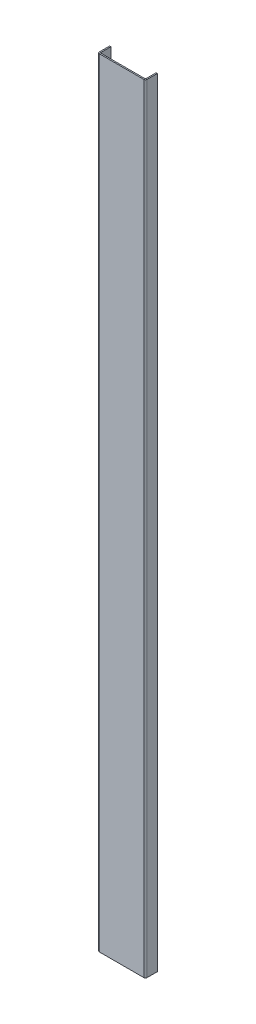
ISO-10303-21;
HEADER;
FILE_DESCRIPTION(('STEP AP214'),'2;1');
FILE_NAME('part.step','',(''),(''),'','','');
FILE_SCHEMA(('AUTOMOTIVE_DESIGN { 1 0 10303 214 1 1 1 1 }'));
ENDSEC;
DATA;
#1=APPLICATION_CONTEXT('core data for automotive mechanical design processes');
#2=APPLICATION_PROTOCOL_DEFINITION('international standard','automotive_design',2000,#1);
#3=PRODUCT_CONTEXT('',#1,'mechanical');
#4=PRODUCT('Part','Part','',(#3));
#5=PRODUCT_RELATED_PRODUCT_CATEGORY('part','',(#4));
#6=PRODUCT_DEFINITION_FORMATION('','',#4);
#7=PRODUCT_DEFINITION_CONTEXT('part definition',#1,'design');
#8=PRODUCT_DEFINITION('design','',#6,#7);
#9=PRODUCT_DEFINITION_SHAPE('','',#8);
#10=(LENGTH_UNIT() NAMED_UNIT(*) SI_UNIT(.MILLI.,.METRE.));
#11=(NAMED_UNIT(*) PLANE_ANGLE_UNIT() SI_UNIT($,.RADIAN.));
#12=(NAMED_UNIT(*) SI_UNIT($,.STERADIAN.) SOLID_ANGLE_UNIT());
#13=UNCERTAINTY_MEASURE_WITH_UNIT(LENGTH_MEASURE(1.E-05),#10,'distance_accuracy_value','');
#14=(GEOMETRIC_REPRESENTATION_CONTEXT(3) GLOBAL_UNCERTAINTY_ASSIGNED_CONTEXT((#13)) GLOBAL_UNIT_ASSIGNED_CONTEXT((#10,
#11,#12)) REPRESENTATION_CONTEXT('',''));
#15=CARTESIAN_POINT('',(0.,0.,0.));
#16=DIRECTION('',(0.,0.,1.));
#17=DIRECTION('',(1.,0.,0.));
#18=AXIS2_PLACEMENT_3D('',#15,#16,#17);
#19=CARTESIAN_POINT('',(-28.25,921.5,-1.99999999999999));
#20=DIRECTION('',(0.,1.,0.));
#21=DIRECTION('',(0.,0.,1.));
#22=AXIS2_PLACEMENT_3D('',#19,#20,#21);
#23=PLANE('',#22);
#24=DIRECTION('',(1.,0.,0.));
#25=VECTOR('',#24,1.);
#26=CARTESIAN_POINT('',(-28.25,921.5,-1.99999999999999));
#27=LINE('',#26,#25);
#28=CARTESIAN_POINT('',(-28.25,921.5,-1.99999999999999));
#29=VERTEX_POINT('',#28);
#30=CARTESIAN_POINT('',(-26.75,921.5,-1.99999999999999));
#31=VERTEX_POINT('',#30);
#32=EDGE_CURVE('E11',#29,#31,#27,.T.);
#33=ORIENTED_EDGE('',*,*,#32,.F.);
#34=CARTESIAN_POINT('',(-26.25,921.5,-1.99999999999999));
#35=DIRECTION('',(0.,-1.,0.));
#36=DIRECTION('',(0.,0.,-1.));
#37=AXIS2_PLACEMENT_3D('',#34,#35,#36);
#38=CIRCLE('',#37,2.);
#39=CARTESIAN_POINT('',(-26.25,921.5,0.));
#40=VERTEX_POINT('',#39);
#41=EDGE_CURVE('E148',#29,#40,#38,.F.);
#42=ORIENTED_EDGE('',*,*,#41,.T.);
#43=DIRECTION('',(0.,0.,1.));
#44=VECTOR('',#43,1.);
#45=CARTESIAN_POINT('',(-26.25,921.5,-1.49999999999999));
#46=LINE('',#45,#44);
#47=CARTESIAN_POINT('',(-26.25,921.5,-1.49999999999999));
#48=VERTEX_POINT('',#47);
#49=EDGE_CURVE('E46',#48,#40,#46,.T.);
#50=ORIENTED_EDGE('',*,*,#49,.F.);
#51=CARTESIAN_POINT('',(-26.25,921.5,-1.99999999999999));
#52=DIRECTION('',(0.,1.,0.));
#53=DIRECTION('',(1.,0.,0.));
#54=AXIS2_PLACEMENT_3D('',#51,#52,#53);
#55=CIRCLE('',#54,0.5);
#56=EDGE_CURVE('E242',#31,#48,#55,.T.);
#57=ORIENTED_EDGE('',*,*,#56,.F.);
#58=EDGE_LOOP('',(#33,#42,#50,#57));
#59=FACE_BOUND('',#58,.T.);
#60=ADVANCED_FACE('F38',(#59),#23,.T.);
#61=CARTESIAN_POINT('',(-26.25,921.5,-1.49999999999999));
#62=DIRECTION('',(0.,1.,0.));
#63=DIRECTION('',(0.,0.,1.));
#64=AXIS2_PLACEMENT_3D('',#61,#62,#63);
#65=PLANE('',#64);
#66=DIRECTION('',(0.,0.,1.));
#67=VECTOR('',#66,1.);
#68=CARTESIAN_POINT('',(-28.25,921.5,0.));
#69=LINE('',#68,#67);
#70=CARTESIAN_POINT('',(-28.25,921.5,-14.));
#71=VERTEX_POINT('',#70);
#72=EDGE_CURVE('E153',#71,#29,#69,.T.);
#73=ORIENTED_EDGE('',*,*,#72,.T.);
#74=ORIENTED_EDGE('',*,*,#32,.T.);
#75=DIRECTION('',(0.,0.,1.));
#76=VECTOR('',#75,1.);
#77=CARTESIAN_POINT('',(-26.75,921.5,0.));
#78=LINE('',#77,#76);
#79=CARTESIAN_POINT('',(-26.75,921.5,-14.));
#80=VERTEX_POINT('',#79);
#81=EDGE_CURVE('E255',#80,#31,#78,.T.);
#82=ORIENTED_EDGE('',*,*,#81,.F.);
#83=DIRECTION('',(1.,0.,0.));
#84=VECTOR('',#83,1.);
#85=CARTESIAN_POINT('',(-28.25,921.5,-14.));
#86=LINE('',#85,#84);
#87=EDGE_CURVE('E257',#71,#80,#86,.T.);
#88=ORIENTED_EDGE('',*,*,#87,.F.);
#89=EDGE_LOOP('',(#73,#74,#82,#88));
#90=FACE_BOUND('',#89,.T.);
#91=ADVANCED_FACE('F268',(#90),#65,.T.);
#92=CARTESIAN_POINT('',(-26.25,0.,0.));
#93=DIRECTION('',(0.,-1.,0.));
#94=DIRECTION('',(0.,0.,-1.));
#95=AXIS2_PLACEMENT_3D('',#92,#93,#94);
#96=PLANE('',#95);
#97=DIRECTION('',(0.,0.,-1.));
#98=VECTOR('',#97,1.);
#99=CARTESIAN_POINT('',(-26.25,0.,0.));
#100=LINE('',#99,#98);
#101=CARTESIAN_POINT('',(-26.25,0.,0.));
#102=VERTEX_POINT('',#101);
#103=CARTESIAN_POINT('',(-26.25,0.,-1.49999999999999));
#104=VERTEX_POINT('',#103);
#105=EDGE_CURVE('E146',#102,#104,#100,.T.);
#106=ORIENTED_EDGE('',*,*,#105,.F.);
#107=CARTESIAN_POINT('',(-26.25,0.,-1.99999999999999));
#108=DIRECTION('',(0.,-1.,0.));
#109=DIRECTION('',(0.,0.,-1.));
#110=AXIS2_PLACEMENT_3D('',#107,#108,#109);
#111=CIRCLE('',#110,2.);
#112=CARTESIAN_POINT('',(-28.25,0.,-1.99999999999999));
#113=VERTEX_POINT('',#112);
#114=EDGE_CURVE('E160',#113,#102,#111,.F.);
#115=ORIENTED_EDGE('',*,*,#114,.F.);
#116=DIRECTION('',(-1.,0.,0.));
#117=VECTOR('',#116,1.);
#118=CARTESIAN_POINT('',(-26.75,0.,-1.99999999999999));
#119=LINE('',#118,#117);
#120=CARTESIAN_POINT('',(-26.75,0.,-1.99999999999999));
#121=VERTEX_POINT('',#120);
#122=EDGE_CURVE('E233',#121,#113,#119,.T.);
#123=ORIENTED_EDGE('',*,*,#122,.F.);
#124=CARTESIAN_POINT('',(-26.25,0.,-1.99999999999999));
#125=DIRECTION('',(0.,1.,0.));
#126=DIRECTION('',(1.,0.,0.));
#127=AXIS2_PLACEMENT_3D('',#124,#125,#126);
#128=CIRCLE('',#127,0.5);
#129=EDGE_CURVE('E187',#121,#104,#128,.T.);
#130=ORIENTED_EDGE('',*,*,#129,.T.);
#131=EDGE_LOOP('',(#106,#115,#123,#130));
#132=FACE_BOUND('',#131,.T.);
#133=ADVANCED_FACE('F247',(#132),#96,.T.);
#134=CARTESIAN_POINT('',(-26.75,0.,-1.99999999999999));
#135=DIRECTION('',(0.,-1.,0.));
#136=DIRECTION('',(0.,0.,-1.));
#137=AXIS2_PLACEMENT_3D('',#134,#135,#136);
#138=PLANE('',#137);
#139=DIRECTION('',(1.,0.,0.));
#140=VECTOR('',#139,1.);
#141=CARTESIAN_POINT('',(28.25,0.,0.));
#142=LINE('',#141,#140);
#143=CARTESIAN_POINT('',(26.25,0.,0.));
#144=VERTEX_POINT('',#143);
#145=EDGE_CURVE('E200',#102,#144,#142,.T.);
#146=ORIENTED_EDGE('',*,*,#145,.F.);
#147=ORIENTED_EDGE('',*,*,#105,.T.);
#148=DIRECTION('',(1.,0.,0.));
#149=VECTOR('',#148,1.);
#150=CARTESIAN_POINT('',(28.25,0.,-1.50000000000001));
#151=LINE('',#150,#149);
#152=CARTESIAN_POINT('',(26.25,0.,-1.50000000000001));
#153=VERTEX_POINT('',#152);
#154=EDGE_CURVE('E185',#104,#153,#151,.T.);
#155=ORIENTED_EDGE('',*,*,#154,.T.);
#156=DIRECTION('',(0.,0.,1.));
#157=VECTOR('',#156,1.);
#158=CARTESIAN_POINT('',(26.25,0.,-1.50000000000001));
#159=LINE('',#158,#157);
#160=EDGE_CURVE('E95',#153,#144,#159,.T.);
#161=ORIENTED_EDGE('',*,*,#160,.T.);
#162=EDGE_LOOP('',(#146,#147,#155,#161));
#163=FACE_BOUND('',#162,.T.);
#164=ADVANCED_FACE('F235',(#163),#138,.T.);
#165=CARTESIAN_POINT('',(26.25,921.5,0.));
#166=DIRECTION('',(0.,1.,0.));
#167=DIRECTION('',(0.,0.,1.));
#168=AXIS2_PLACEMENT_3D('',#165,#166,#167);
#169=PLANE('',#168);
#170=DIRECTION('',(0.,0.,-1.));
#171=VECTOR('',#170,1.);
#172=CARTESIAN_POINT('',(26.25,921.5,0.));
#173=LINE('',#172,#171);
#174=CARTESIAN_POINT('',(26.25,921.5,0.));
#175=VERTEX_POINT('',#174);
#176=CARTESIAN_POINT('',(26.25,921.5,-1.50000000000001));
#177=VERTEX_POINT('',#176);
#178=EDGE_CURVE('E231',#175,#177,#173,.T.);
#179=ORIENTED_EDGE('',*,*,#178,.F.);
#180=CARTESIAN_POINT('',(26.25,921.5,-2.00000000000001));
#181=DIRECTION('',(0.,-1.,0.));
#182=DIRECTION('',(0.,0.,-1.));
#183=AXIS2_PLACEMENT_3D('',#180,#181,#182);
#184=CIRCLE('',#183,2.);
#185=CARTESIAN_POINT('',(28.25,921.5,-2.00000000000001));
#186=VERTEX_POINT('',#185);
#187=EDGE_CURVE('E168',#175,#186,#184,.F.);
#188=ORIENTED_EDGE('',*,*,#187,.T.);
#189=DIRECTION('',(1.,0.,0.));
#190=VECTOR('',#189,1.);
#191=CARTESIAN_POINT('',(26.75,921.5,-2.00000000000001));
#192=LINE('',#191,#190);
#193=CARTESIAN_POINT('',(26.75,921.5,-2.00000000000001));
#194=VERTEX_POINT('',#193);
#195=EDGE_CURVE('E54',#194,#186,#192,.T.);
#196=ORIENTED_EDGE('',*,*,#195,.F.);
#197=CARTESIAN_POINT('',(26.25,921.5,-2.00000000000001));
#198=DIRECTION('',(0.,1.,0.));
#199=DIRECTION('',(1.,0.,0.));
#200=AXIS2_PLACEMENT_3D('',#197,#198,#199);
#201=CIRCLE('',#200,0.5);
#202=EDGE_CURVE('E259',#177,#194,#201,.T.);
#203=ORIENTED_EDGE('',*,*,#202,.F.);
#204=EDGE_LOOP('',(#179,#188,#196,#203));
#205=FACE_BOUND('',#204,.T.);
#206=ADVANCED_FACE('F294',(#205),#169,.T.);
#207=CARTESIAN_POINT('',(26.75,921.5,-2.00000000000001));
#208=DIRECTION('',(0.,1.,0.));
#209=DIRECTION('',(0.,0.,1.));
#210=AXIS2_PLACEMENT_3D('',#207,#208,#209);
#211=PLANE('',#210);
#212=DIRECTION('',(1.,0.,0.));
#213=VECTOR('',#212,1.);
#214=CARTESIAN_POINT('',(28.25,921.5,0.));
#215=LINE('',#214,#213);
#216=EDGE_CURVE('E138',#40,#175,#215,.T.);
#217=ORIENTED_EDGE('',*,*,#216,.T.);
#218=ORIENTED_EDGE('',*,*,#178,.T.);
#219=DIRECTION('',(1.,0.,0.));
#220=VECTOR('',#219,1.);
#221=CARTESIAN_POINT('',(28.25,921.5,-1.50000000000001));
#222=LINE('',#221,#220);
#223=EDGE_CURVE('E141',#48,#177,#222,.T.);
#224=ORIENTED_EDGE('',*,*,#223,.F.);
#225=ORIENTED_EDGE('',*,*,#49,.T.);
#226=EDGE_LOOP('',(#217,#218,#224,#225));
#227=FACE_BOUND('',#226,.T.);
#228=ADVANCED_FACE('F136',(#227),#211,.T.);
#229=CARTESIAN_POINT('',(28.25,0.,-2.00000000000001));
#230=DIRECTION('',(0.,-1.,0.));
#231=DIRECTION('',(0.,0.,-1.));
#232=AXIS2_PLACEMENT_3D('',#229,#230,#231);
#233=PLANE('',#232);
#234=DIRECTION('',(-1.,0.,0.));
#235=VECTOR('',#234,1.);
#236=CARTESIAN_POINT('',(28.25,0.,-2.00000000000001));
#237=LINE('',#236,#235);
#238=CARTESIAN_POINT('',(28.25,0.,-2.00000000000001));
#239=VERTEX_POINT('',#238);
#240=CARTESIAN_POINT('',(26.75,0.,-2.00000000000001));
#241=VERTEX_POINT('',#240);
#242=EDGE_CURVE('E102',#239,#241,#237,.T.);
#243=ORIENTED_EDGE('',*,*,#242,.F.);
#244=CARTESIAN_POINT('',(26.25,0.,-2.00000000000001));
#245=DIRECTION('',(0.,-1.,0.));
#246=DIRECTION('',(0.,0.,-1.));
#247=AXIS2_PLACEMENT_3D('',#244,#245,#246);
#248=CIRCLE('',#247,2.);
#249=EDGE_CURVE('E202',#144,#239,#248,.F.);
#250=ORIENTED_EDGE('',*,*,#249,.F.);
#251=ORIENTED_EDGE('',*,*,#160,.F.);
#252=CARTESIAN_POINT('',(26.25,0.,-2.00000000000001));
#253=DIRECTION('',(0.,1.,0.));
#254=DIRECTION('',(1.,0.,0.));
#255=AXIS2_PLACEMENT_3D('',#252,#253,#254);
#256=CIRCLE('',#255,0.5);
#257=EDGE_CURVE('E183',#153,#241,#256,.T.);
#258=ORIENTED_EDGE('',*,*,#257,.T.);
#259=EDGE_LOOP('',(#243,#250,#251,#258));
#260=FACE_BOUND('',#259,.T.);
#261=ADVANCED_FACE('F300',(#260),#233,.T.);
#262=CARTESIAN_POINT('',(26.25,0.,-1.50000000000001));
#263=DIRECTION('',(0.,-1.,0.));
#264=DIRECTION('',(0.,0.,-1.));
#265=AXIS2_PLACEMENT_3D('',#262,#263,#264);
#266=PLANE('',#265);
#267=DIRECTION('',(0.,0.,-1.));
#268=VECTOR('',#267,1.);
#269=CARTESIAN_POINT('',(28.25,0.,0.));
#270=LINE('',#269,#268);
#271=CARTESIAN_POINT('',(28.25,0.,-14.));
#272=VERTEX_POINT('',#271);
#273=EDGE_CURVE('E174',#239,#272,#270,.T.);
#274=ORIENTED_EDGE('',*,*,#273,.F.);
#275=ORIENTED_EDGE('',*,*,#242,.T.);
#276=DIRECTION('',(0.,0.,-1.));
#277=VECTOR('',#276,1.);
#278=CARTESIAN_POINT('',(26.75,0.,0.));
#279=LINE('',#278,#277);
#280=CARTESIAN_POINT('',(26.75,0.,-14.));
#281=VERTEX_POINT('',#280);
#282=EDGE_CURVE('E180',#241,#281,#279,.T.);
#283=ORIENTED_EDGE('',*,*,#282,.T.);
#284=DIRECTION('',(1.,0.,0.));
#285=VECTOR('',#284,1.);
#286=CARTESIAN_POINT('',(26.75,0.,-14.));
#287=LINE('',#286,#285);
#288=EDGE_CURVE('E177',#281,#272,#287,.T.);
#289=ORIENTED_EDGE('',*,*,#288,.T.);
#290=EDGE_LOOP('',(#274,#275,#283,#289));
#291=FACE_BOUND('',#290,.T.);
#292=ADVANCED_FACE('F303',(#291),#266,.T.);
#293=CARTESIAN_POINT('',(28.25,921.5,0.));
#294=DIRECTION('',(-1.,0.,0.));
#295=DIRECTION('',(0.,0.,1.));
#296=AXIS2_PLACEMENT_3D('',#293,#294,#295);
#297=PLANE('',#296);
#298=ORIENTED_EDGE('',*,*,#273,.T.);
#299=DIRECTION('',(0.,-1.,0.));
#300=VECTOR('',#299,1.);
#301=CARTESIAN_POINT('',(28.25,921.5,-14.));
#302=LINE('',#301,#300);
#303=CARTESIAN_POINT('',(28.25,921.5,-14.));
#304=VERTEX_POINT('',#303);
#305=EDGE_CURVE('E226',#304,#272,#302,.T.);
#306=ORIENTED_EDGE('',*,*,#305,.F.);
#307=DIRECTION('',(0.,0.,-1.));
#308=VECTOR('',#307,1.);
#309=CARTESIAN_POINT('',(28.25,921.5,0.));
#310=LINE('',#309,#308);
#311=EDGE_CURVE('E108',#186,#304,#310,.T.);
#312=ORIENTED_EDGE('',*,*,#311,.F.);
#313=DIRECTION('',(0.,-1.,0.));
#314=VECTOR('',#313,1.);
#315=CARTESIAN_POINT('',(28.25,921.5,-2.00000000000001));
#316=LINE('',#315,#314);
#317=EDGE_CURVE('E170',#186,#239,#316,.T.);
#318=ORIENTED_EDGE('',*,*,#317,.T.);
#319=EDGE_LOOP('',(#298,#306,#312,#318));
#320=FACE_BOUND('',#319,.T.);
#321=ADVANCED_FACE('F306',(#320),#297,.F.);
#322=CARTESIAN_POINT('',(26.75,921.5,-14.));
#323=DIRECTION('',(0.,0.,-1.));
#324=DIRECTION('',(-1.,0.,0.));
#325=AXIS2_PLACEMENT_3D('',#322,#323,#324);
#326=PLANE('',#325);
#327=ORIENTED_EDGE('',*,*,#288,.F.);
#328=DIRECTION('',(0.,-1.,0.));
#329=VECTOR('',#328,1.);
#330=CARTESIAN_POINT('',(26.75,921.5,-14.));
#331=LINE('',#330,#329);
#332=CARTESIAN_POINT('',(26.75,921.5,-14.));
#333=VERTEX_POINT('',#332);
#334=EDGE_CURVE('E224',#333,#281,#331,.T.);
#335=ORIENTED_EDGE('',*,*,#334,.F.);
#336=DIRECTION('',(1.,0.,0.));
#337=VECTOR('',#336,1.);
#338=CARTESIAN_POINT('',(26.75,921.5,-14.));
#339=LINE('',#338,#337);
#340=EDGE_CURVE('E514',#333,#304,#339,.T.);
#341=ORIENTED_EDGE('',*,*,#340,.T.);
#342=ORIENTED_EDGE('',*,*,#305,.T.);
#343=EDGE_LOOP('',(#327,#335,#341,#342));
#344=FACE_BOUND('',#343,.T.);
#345=ADVANCED_FACE('F310',(#344),#326,.T.);
#346=CARTESIAN_POINT('',(26.75,921.5,0.));
#347=DIRECTION('',(-1.,0.,0.));
#348=DIRECTION('',(0.,0.,1.));
#349=AXIS2_PLACEMENT_3D('',#346,#347,#348);
#350=PLANE('',#349);
#351=ORIENTED_EDGE('',*,*,#282,.F.);
#352=DIRECTION('',(0.,-1.,0.));
#353=VECTOR('',#352,1.);
#354=CARTESIAN_POINT('',(26.75,921.5,-2.00000000000001));
#355=LINE('',#354,#353);
#356=EDGE_CURVE('E221',#194,#241,#355,.T.);
#357=ORIENTED_EDGE('',*,*,#356,.F.);
#358=DIRECTION('',(0.,0.,-1.));
#359=VECTOR('',#358,1.);
#360=CARTESIAN_POINT('',(26.75,921.5,0.));
#361=LINE('',#360,#359);
#362=EDGE_CURVE('E516',#194,#333,#361,.T.);
#363=ORIENTED_EDGE('',*,*,#362,.T.);
#364=ORIENTED_EDGE('',*,*,#334,.T.);
#365=EDGE_LOOP('',(#351,#357,#363,#364));
#366=FACE_BOUND('',#365,.T.);
#367=ADVANCED_FACE('F314',(#366),#350,.T.);
#368=CARTESIAN_POINT('',(26.25,921.5,-2.00000000000001));
#369=DIRECTION('',(0.,-1.,0.));
#370=DIRECTION('',(0.,0.,-1.));
#371=AXIS2_PLACEMENT_3D('',#368,#369,#370);
#372=CYLINDRICAL_SURFACE('',#371,0.5);
#373=ORIENTED_EDGE('',*,*,#257,.F.);
#374=DIRECTION('',(0.,-1.,0.));
#375=VECTOR('',#374,1.);
#376=CARTESIAN_POINT('',(26.25,921.5,-1.50000000000001));
#377=LINE('',#376,#375);
#378=EDGE_CURVE('E218',#177,#153,#377,.T.);
#379=ORIENTED_EDGE('',*,*,#378,.F.);
#380=ORIENTED_EDGE('',*,*,#202,.T.);
#381=ORIENTED_EDGE('',*,*,#356,.T.);
#382=EDGE_LOOP('',(#373,#379,#380,#381));
#383=FACE_BOUND('',#382,.T.);
#384=ADVANCED_FACE('F318',(#383),#372,.F.);
#385=CARTESIAN_POINT('',(28.25,921.5,-1.50000000000001));
#386=DIRECTION('',(0.,0.,-1.));
#387=DIRECTION('',(-1.,0.,0.));
#388=AXIS2_PLACEMENT_3D('',#385,#386,#387);
#389=PLANE('',#388);
#390=ORIENTED_EDGE('',*,*,#154,.F.);
#391=DIRECTION('',(0.,-1.,0.));
#392=VECTOR('',#391,1.);
#393=CARTESIAN_POINT('',(-26.25,921.5,-1.49999999999999));
#394=LINE('',#393,#392);
#395=EDGE_CURVE('E215',#48,#104,#394,.T.);
#396=ORIENTED_EDGE('',*,*,#395,.F.);
#397=ORIENTED_EDGE('',*,*,#223,.T.);
#398=ORIENTED_EDGE('',*,*,#378,.T.);
#399=EDGE_LOOP('',(#390,#396,#397,#398));
#400=FACE_BOUND('',#399,.T.);
#401=ADVANCED_FACE('F244',(#400),#389,.T.);
#402=CARTESIAN_POINT('',(-26.25,921.5,-1.99999999999999));
#403=DIRECTION('',(0.,-1.,0.));
#404=DIRECTION('',(0.,0.,-1.));
#405=AXIS2_PLACEMENT_3D('',#402,#403,#404);
#406=CYLINDRICAL_SURFACE('',#405,0.5);
#407=ORIENTED_EDGE('',*,*,#129,.F.);
#408=DIRECTION('',(0.,-1.,0.));
#409=VECTOR('',#408,1.);
#410=CARTESIAN_POINT('',(-26.75,921.5,-1.99999999999999));
#411=LINE('',#410,#409);
#412=EDGE_CURVE('E212',#31,#121,#411,.T.);
#413=ORIENTED_EDGE('',*,*,#412,.F.);
#414=ORIENTED_EDGE('',*,*,#56,.T.);
#415=ORIENTED_EDGE('',*,*,#395,.T.);
#416=EDGE_LOOP('',(#407,#413,#414,#415));
#417=FACE_BOUND('',#416,.T.);
#418=ADVANCED_FACE('F240',(#417),#406,.F.);
#419=CARTESIAN_POINT('',(-26.75,921.5,0.));
#420=DIRECTION('',(1.,0.,0.));
#421=DIRECTION('',(0.,0.,-1.));
#422=AXIS2_PLACEMENT_3D('',#419,#420,#421);
#423=PLANE('',#422);
#424=DIRECTION('',(0.,0.,1.));
#425=VECTOR('',#424,1.);
#426=CARTESIAN_POINT('',(-26.75,0.,0.));
#427=LINE('',#426,#425);
#428=CARTESIAN_POINT('',(-26.75,0.,-14.));
#429=VERTEX_POINT('',#428);
#430=EDGE_CURVE('E190',#429,#121,#427,.T.);
#431=ORIENTED_EDGE('',*,*,#430,.F.);
#432=DIRECTION('',(0.,-1.,0.));
#433=VECTOR('',#432,1.);
#434=CARTESIAN_POINT('',(-26.75,921.5,-14.));
#435=LINE('',#434,#433);
#436=EDGE_CURVE('E210',#80,#429,#435,.T.);
#437=ORIENTED_EDGE('',*,*,#436,.F.);
#438=ORIENTED_EDGE('',*,*,#81,.T.);
#439=ORIENTED_EDGE('',*,*,#412,.T.);
#440=EDGE_LOOP('',(#431,#437,#438,#439));
#441=FACE_BOUND('',#440,.T.);
#442=ADVANCED_FACE('F253',(#441),#423,.T.);
#443=CARTESIAN_POINT('',(-28.25,921.5,-14.));
#444=DIRECTION('',(0.,0.,-1.));
#445=DIRECTION('',(-1.,0.,0.));
#446=AXIS2_PLACEMENT_3D('',#443,#444,#445);
#447=PLANE('',#446);
#448=DIRECTION('',(1.,0.,0.));
#449=VECTOR('',#448,1.);
#450=CARTESIAN_POINT('',(-28.25,0.,-14.));
#451=LINE('',#450,#449);
#452=CARTESIAN_POINT('',(-28.25,0.,-14.));
#453=VERTEX_POINT('',#452);
#454=EDGE_CURVE('E193',#453,#429,#451,.T.);
#455=ORIENTED_EDGE('',*,*,#454,.F.);
#456=DIRECTION('',(0.,-1.,0.));
#457=VECTOR('',#456,1.);
#458=CARTESIAN_POINT('',(-28.25,921.5,-14.));
#459=LINE('',#458,#457);
#460=EDGE_CURVE('E208',#71,#453,#459,.T.);
#461=ORIENTED_EDGE('',*,*,#460,.F.);
#462=ORIENTED_EDGE('',*,*,#87,.T.);
#463=ORIENTED_EDGE('',*,*,#436,.T.);
#464=EDGE_LOOP('',(#455,#461,#462,#463));
#465=FACE_BOUND('',#464,.T.);
#466=ADVANCED_FACE('F274',(#465),#447,.T.);
#467=CARTESIAN_POINT('',(-28.25,921.5,0.));
#468=DIRECTION('',(1.,0.,0.));
#469=DIRECTION('',(0.,0.,-1.));
#470=AXIS2_PLACEMENT_3D('',#467,#468,#469);
#471=PLANE('',#470);
#472=DIRECTION('',(0.,0.,1.));
#473=VECTOR('',#472,1.);
#474=CARTESIAN_POINT('',(-28.25,0.,0.));
#475=LINE('',#474,#473);
#476=EDGE_CURVE('E196',#453,#113,#475,.T.);
#477=ORIENTED_EDGE('',*,*,#476,.T.);
#478=DIRECTION('',(0.,-1.,0.));
#479=VECTOR('',#478,1.);
#480=CARTESIAN_POINT('',(-28.25,921.5,-1.99999999999999));
#481=LINE('',#480,#479);
#482=EDGE_CURVE('E162',#29,#113,#481,.T.);
#483=ORIENTED_EDGE('',*,*,#482,.F.);
#484=ORIENTED_EDGE('',*,*,#72,.F.);
#485=ORIENTED_EDGE('',*,*,#460,.T.);
#486=EDGE_LOOP('',(#477,#483,#484,#485));
#487=FACE_BOUND('',#486,.T.);
#488=ADVANCED_FACE('F270',(#487),#471,.F.);
#489=CARTESIAN_POINT('',(-26.25,921.5,-1.99999999999999));
#490=DIRECTION('',(0.,-1.,0.));
#491=DIRECTION('',(0.,0.,-1.));
#492=AXIS2_PLACEMENT_3D('',#489,#490,#491);
#493=CYLINDRICAL_SURFACE('',#492,2.);
#494=ORIENTED_EDGE('',*,*,#114,.T.);
#495=DIRECTION('',(0.,-1.,0.));
#496=VECTOR('',#495,1.);
#497=CARTESIAN_POINT('',(-26.25,921.5,0.));
#498=LINE('',#497,#496);
#499=EDGE_CURVE('E157',#40,#102,#498,.T.);
#500=ORIENTED_EDGE('',*,*,#499,.F.);
#501=ORIENTED_EDGE('',*,*,#41,.F.);
#502=ORIENTED_EDGE('',*,*,#482,.T.);
#503=EDGE_LOOP('',(#494,#500,#501,#502));
#504=FACE_BOUND('',#503,.T.);
#505=ADVANCED_FACE('F158',(#504),#493,.T.);
#506=CARTESIAN_POINT('',(28.25,921.5,0.));
#507=DIRECTION('',(0.,0.,-1.));
#508=DIRECTION('',(-1.,0.,0.));
#509=AXIS2_PLACEMENT_3D('',#506,#507,#508);
#510=PLANE('',#509);
#511=ORIENTED_EDGE('',*,*,#145,.T.);
#512=DIRECTION('',(0.,-1.,0.));
#513=VECTOR('',#512,1.);
#514=CARTESIAN_POINT('',(26.25,921.5,0.));
#515=LINE('',#514,#513);
#516=EDGE_CURVE('E163',#175,#144,#515,.T.);
#517=ORIENTED_EDGE('',*,*,#516,.F.);
#518=ORIENTED_EDGE('',*,*,#216,.F.);
#519=ORIENTED_EDGE('',*,*,#499,.T.);
#520=EDGE_LOOP('',(#511,#517,#518,#519));
#521=FACE_BOUND('',#520,.T.);
#522=ADVANCED_FACE('F165',(#521),#510,.F.);
#523=CARTESIAN_POINT('',(26.25,921.5,-2.00000000000001));
#524=DIRECTION('',(0.,-1.,0.));
#525=DIRECTION('',(0.,0.,-1.));
#526=AXIS2_PLACEMENT_3D('',#523,#524,#525);
#527=CYLINDRICAL_SURFACE('',#526,2.);
#528=ORIENTED_EDGE('',*,*,#249,.T.);
#529=ORIENTED_EDGE('',*,*,#317,.F.);
#530=ORIENTED_EDGE('',*,*,#187,.F.);
#531=ORIENTED_EDGE('',*,*,#516,.T.);
#532=EDGE_LOOP('',(#528,#529,#530,#531));
#533=FACE_BOUND('',#532,.T.);
#534=ADVANCED_FACE('F365',(#533),#527,.T.);
#535=CARTESIAN_POINT('',(26.25,921.5,-2.00000000000001));
#536=DIRECTION('',(0.,1.,0.));
#537=DIRECTION('',(1.,0.,0.));
#538=AXIS2_PLACEMENT_3D('',#535,#536,#537);
#539=PLANE('',#538);
#540=ORIENTED_EDGE('',*,*,#311,.T.);
#541=ORIENTED_EDGE('',*,*,#340,.F.);
#542=ORIENTED_EDGE('',*,*,#362,.F.);
#543=ORIENTED_EDGE('',*,*,#195,.T.);
#544=EDGE_LOOP('',(#540,#541,#542,#543));
#545=FACE_BOUND('',#544,.T.);
#546=ADVANCED_FACE('F375',(#545),#539,.T.);
#547=CARTESIAN_POINT('',(26.25,0.,-2.00000000000001));
#548=DIRECTION('',(0.,1.,0.));
#549=DIRECTION('',(1.,0.,0.));
#550=AXIS2_PLACEMENT_3D('',#547,#548,#549);
#551=PLANE('',#550);
#552=ORIENTED_EDGE('',*,*,#430,.T.);
#553=ORIENTED_EDGE('',*,*,#122,.T.);
#554=ORIENTED_EDGE('',*,*,#476,.F.);
#555=ORIENTED_EDGE('',*,*,#454,.T.);
#556=EDGE_LOOP('',(#552,#553,#554,#555));
#557=FACE_BOUND('',#556,.T.);
#558=ADVANCED_FACE('F272',(#557),#551,.F.);
#559=CLOSED_SHELL('',(#60,#91,#133,#164,#206,#228,#261,#292,#321,#345,#367,#384,#401,#418,#442,
#466,#488,#505,#522,#534,#546,#558));
#560=MANIFOLD_SOLID_BREP('B2',#559);
#561=ADVANCED_BREP_SHAPE_REPRESENTATION('',(#18,#560),#14);
#562=SHAPE_DEFINITION_REPRESENTATION(#9,#561);
ENDSEC;
END-ISO-10303-21;
